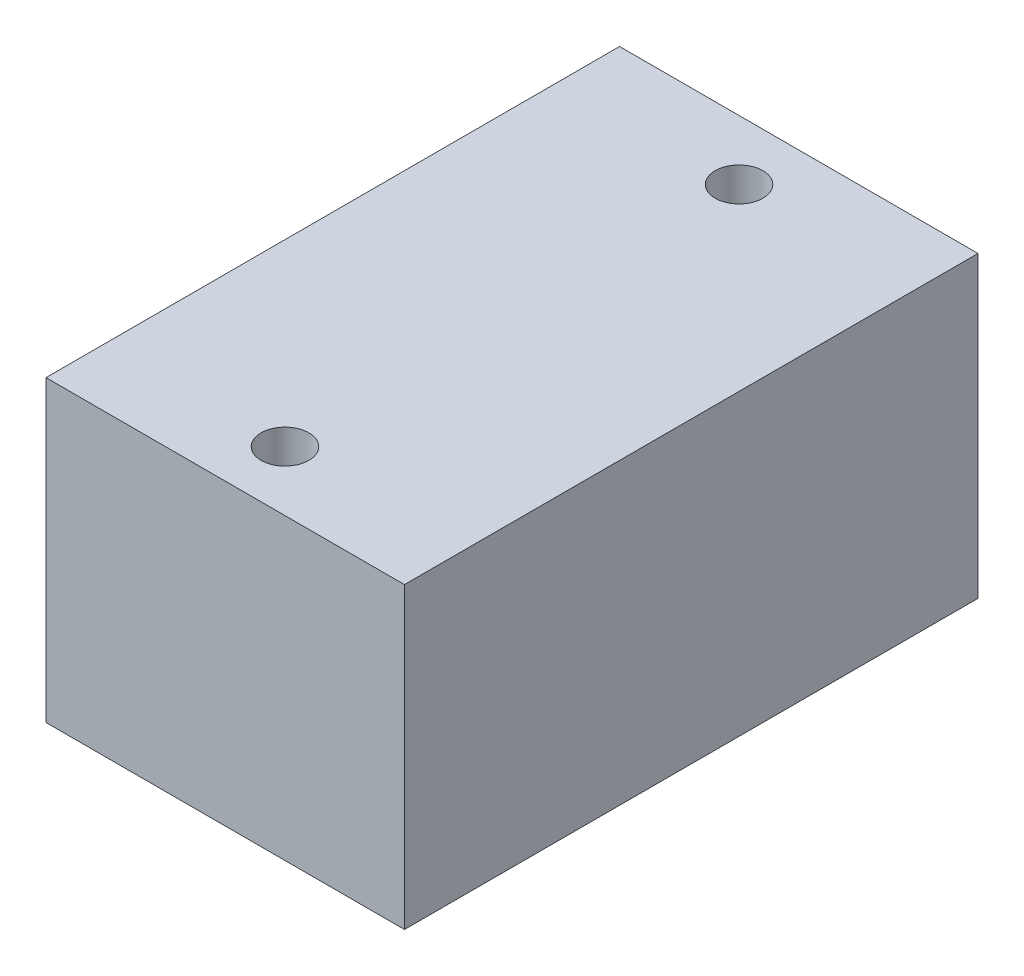
ISO-10303-21;
HEADER;
FILE_DESCRIPTION(('STEP AP214'),'2;1');
FILE_NAME('part.step','',(''),(''),'','','');
FILE_SCHEMA(('AUTOMOTIVE_DESIGN { 1 0 10303 214 1 1 1 1 }'));
ENDSEC;
DATA;
#1=APPLICATION_CONTEXT('core data for automotive mechanical design processes');
#2=APPLICATION_PROTOCOL_DEFINITION('international standard','automotive_design',2000,#1);
#3=PRODUCT_CONTEXT('',#1,'mechanical');
#4=PRODUCT('Part','Part','',(#3));
#5=PRODUCT_RELATED_PRODUCT_CATEGORY('part','',(#4));
#6=PRODUCT_DEFINITION_FORMATION('','',#4);
#7=PRODUCT_DEFINITION_CONTEXT('part definition',#1,'design');
#8=PRODUCT_DEFINITION('design','',#6,#7);
#9=PRODUCT_DEFINITION_SHAPE('','',#8);
#10=(LENGTH_UNIT() NAMED_UNIT(*) SI_UNIT(.MILLI.,.METRE.));
#11=(NAMED_UNIT(*) PLANE_ANGLE_UNIT() SI_UNIT($,.RADIAN.));
#12=(NAMED_UNIT(*) SI_UNIT($,.STERADIAN.) SOLID_ANGLE_UNIT());
#13=UNCERTAINTY_MEASURE_WITH_UNIT(LENGTH_MEASURE(1.E-05),#10,'distance_accuracy_value','');
#14=(GEOMETRIC_REPRESENTATION_CONTEXT(3) GLOBAL_UNCERTAINTY_ASSIGNED_CONTEXT((#13)) GLOBAL_UNIT_ASSIGNED_CONTEXT((#10,
#11,#12)) REPRESENTATION_CONTEXT('',''));
#15=CARTESIAN_POINT('',(0.,0.,0.));
#16=DIRECTION('',(0.,0.,1.));
#17=DIRECTION('',(1.,0.,0.));
#18=AXIS2_PLACEMENT_3D('',#15,#16,#17);
#19=CARTESIAN_POINT('',(0.,0.,48.));
#20=DIRECTION('',(1.,0.,0.));
#21=DIRECTION('',(0.,1.,0.));
#22=AXIS2_PLACEMENT_3D('',#19,#20,#21);
#23=PLANE('',#22);
#24=DIRECTION('',(0.,-1.,0.));
#25=VECTOR('',#24,1.);
#26=CARTESIAN_POINT('',(0.,0.,0.));
#27=LINE('',#26,#25);
#28=CARTESIAN_POINT('',(0.,25.,0.));
#29=VERTEX_POINT('',#28);
#30=CARTESIAN_POINT('',(0.,0.,0.));
#31=VERTEX_POINT('',#30);
#32=EDGE_CURVE('E110',#29,#31,#27,.T.);
#33=ORIENTED_EDGE('',*,*,#32,.T.);
#34=DIRECTION('',(0.,0.,-1.));
#35=VECTOR('',#34,1.);
#36=CARTESIAN_POINT('',(0.,0.,48.));
#37=LINE('',#36,#35);
#38=CARTESIAN_POINT('',(0.,0.,48.));
#39=VERTEX_POINT('',#38);
#40=EDGE_CURVE('E11',#39,#31,#37,.T.);
#41=ORIENTED_EDGE('',*,*,#40,.F.);
#42=DIRECTION('',(0.,-1.,0.));
#43=VECTOR('',#42,1.);
#44=CARTESIAN_POINT('',(0.,0.,48.));
#45=LINE('',#44,#43);
#46=CARTESIAN_POINT('',(0.,25.,48.));
#47=VERTEX_POINT('',#46);
#48=EDGE_CURVE('E93',#47,#39,#45,.T.);
#49=ORIENTED_EDGE('',*,*,#48,.F.);
#50=DIRECTION('',(0.,0.,-1.));
#51=VECTOR('',#50,1.);
#52=CARTESIAN_POINT('',(0.,25.,48.));
#53=LINE('',#52,#51);
#54=EDGE_CURVE('E106',#47,#29,#53,.T.);
#55=ORIENTED_EDGE('',*,*,#54,.T.);
#56=EDGE_LOOP('',(#33,#41,#49,#55));
#57=FACE_BOUND('',#56,.T.);
#58=ADVANCED_FACE('F41',(#57),#23,.F.);
#59=CARTESIAN_POINT('',(0.,0.,48.));
#60=DIRECTION('',(0.,1.,0.));
#61=DIRECTION('',(0.,0.,1.));
#62=AXIS2_PLACEMENT_3D('',#59,#60,#61);
#63=PLANE('',#62);
#64=CARTESIAN_POINT('',(15.,0.,39.));
#65=DIRECTION('',(0.,-1.,0.));
#66=DIRECTION('',(0.,0.,-1.));
#67=AXIS2_PLACEMENT_3D('',#64,#65,#66);
#68=CIRCLE('',#67,2.);
#69=CARTESIAN_POINT('',(15.,0.,37.));
#70=VERTEX_POINT('',#69);
#71=EDGE_CURVE('E157',#70,#70,#68,.T.);
#72=ORIENTED_EDGE('',*,*,#71,.F.);
#73=EDGE_LOOP('',(#72));
#74=FACE_BOUND('',#73,.T.);
#75=CARTESIAN_POINT('',(15.,0.,9.00000000000001));
#76=DIRECTION('',(0.,-1.,0.));
#77=DIRECTION('',(0.,0.,-1.));
#78=AXIS2_PLACEMENT_3D('',#75,#76,#77);
#79=CIRCLE('',#78,2.);
#80=CARTESIAN_POINT('',(15.,0.,7.00000000000001));
#81=VERTEX_POINT('',#80);
#82=EDGE_CURVE('E149',#81,#81,#79,.T.);
#83=ORIENTED_EDGE('',*,*,#82,.F.);
#84=EDGE_LOOP('',(#83));
#85=FACE_BOUND('',#84,.T.);
#86=DIRECTION('',(1.,0.,0.));
#87=VECTOR('',#86,1.);
#88=CARTESIAN_POINT('',(0.,0.,0.));
#89=LINE('',#88,#87);
#90=CARTESIAN_POINT('',(30.,0.,0.));
#91=VERTEX_POINT('',#90);
#92=EDGE_CURVE('E98',#31,#91,#89,.T.);
#93=ORIENTED_EDGE('',*,*,#92,.T.);
#94=DIRECTION('',(0.,0.,-1.));
#95=VECTOR('',#94,1.);
#96=CARTESIAN_POINT('',(30.,0.,47.9999999999999));
#97=LINE('',#96,#95);
#98=CARTESIAN_POINT('',(30.,0.,47.9999999999999));
#99=VERTEX_POINT('',#98);
#100=EDGE_CURVE('E50',#99,#91,#97,.T.);
#101=ORIENTED_EDGE('',*,*,#100,.F.);
#102=DIRECTION('',(1.,0.,0.));
#103=VECTOR('',#102,1.);
#104=CARTESIAN_POINT('',(0.,0.,48.));
#105=LINE('',#104,#103);
#106=EDGE_CURVE('E88',#39,#99,#105,.T.);
#107=ORIENTED_EDGE('',*,*,#106,.F.);
#108=ORIENTED_EDGE('',*,*,#40,.T.);
#109=EDGE_LOOP('',(#93,#101,#107,#108));
#110=FACE_BOUND('',#109,.T.);
#111=ADVANCED_FACE('F97',(#74,#85,#110),#63,.F.);
#112=CARTESIAN_POINT('',(30.,0.,47.9999999999999));
#113=DIRECTION('',(-1.,0.,0.));
#114=DIRECTION('',(0.,0.,1.));
#115=AXIS2_PLACEMENT_3D('',#112,#113,#114);
#116=PLANE('',#115);
#117=DIRECTION('',(0.,1.,0.));
#118=VECTOR('',#117,1.);
#119=CARTESIAN_POINT('',(30.,0.,0.));
#120=LINE('',#119,#118);
#121=CARTESIAN_POINT('',(30.,25.,0.));
#122=VERTEX_POINT('',#121);
#123=EDGE_CURVE('E75',#91,#122,#120,.T.);
#124=ORIENTED_EDGE('',*,*,#123,.T.);
#125=DIRECTION('',(0.,0.,-1.));
#126=VECTOR('',#125,1.);
#127=CARTESIAN_POINT('',(30.,25.,47.9999999999999));
#128=LINE('',#127,#126);
#129=CARTESIAN_POINT('',(30.,25.,47.9999999999999));
#130=VERTEX_POINT('',#129);
#131=EDGE_CURVE('E100',#130,#122,#128,.T.);
#132=ORIENTED_EDGE('',*,*,#131,.F.);
#133=DIRECTION('',(0.,1.,0.));
#134=VECTOR('',#133,1.);
#135=CARTESIAN_POINT('',(30.,0.,47.9999999999999));
#136=LINE('',#135,#134);
#137=EDGE_CURVE('E91',#99,#130,#136,.T.);
#138=ORIENTED_EDGE('',*,*,#137,.F.);
#139=ORIENTED_EDGE('',*,*,#100,.T.);
#140=EDGE_LOOP('',(#124,#132,#138,#139));
#141=FACE_BOUND('',#140,.T.);
#142=ADVANCED_FACE('F101',(#141),#116,.F.);
#143=CARTESIAN_POINT('',(0.,25.,48.));
#144=DIRECTION('',(0.,-1.,0.));
#145=DIRECTION('',(1.,0.,0.));
#146=AXIS2_PLACEMENT_3D('',#143,#144,#145);
#147=PLANE('',#146);
#148=CARTESIAN_POINT('',(15.,25.,5.));
#149=DIRECTION('',(0.,1.,0.));
#150=DIRECTION('',(-1.,0.,0.));
#151=AXIS2_PLACEMENT_3D('',#148,#149,#150);
#152=CIRCLE('',#151,2.);
#153=CARTESIAN_POINT('',(13.,25.,5.));
#154=VERTEX_POINT('',#153);
#155=EDGE_CURVE('E142',#154,#154,#152,.T.);
#156=ORIENTED_EDGE('',*,*,#155,.F.);
#157=EDGE_LOOP('',(#156));
#158=FACE_BOUND('',#157,.T.);
#159=CARTESIAN_POINT('',(14.9999999999999,25.,42.9999999999999));
#160=DIRECTION('',(0.,1.,0.));
#161=DIRECTION('',(-1.,0.,0.));
#162=AXIS2_PLACEMENT_3D('',#159,#160,#161);
#163=CIRCLE('',#162,2.);
#164=CARTESIAN_POINT('',(12.9999999999999,25.,42.9999999999999));
#165=VERTEX_POINT('',#164);
#166=EDGE_CURVE('E133',#165,#165,#163,.T.);
#167=ORIENTED_EDGE('',*,*,#166,.F.);
#168=EDGE_LOOP('',(#167));
#169=FACE_BOUND('',#168,.T.);
#170=DIRECTION('',(-1.,0.,0.));
#171=VECTOR('',#170,1.);
#172=CARTESIAN_POINT('',(0.,25.,0.));
#173=LINE('',#172,#171);
#174=EDGE_CURVE('E81',#122,#29,#173,.T.);
#175=ORIENTED_EDGE('',*,*,#174,.T.);
#176=ORIENTED_EDGE('',*,*,#54,.F.);
#177=DIRECTION('',(-1.,0.,0.));
#178=VECTOR('',#177,1.);
#179=CARTESIAN_POINT('',(0.,25.,48.));
#180=LINE('',#179,#178);
#181=EDGE_CURVE('E58',#130,#47,#180,.T.);
#182=ORIENTED_EDGE('',*,*,#181,.F.);
#183=ORIENTED_EDGE('',*,*,#131,.T.);
#184=EDGE_LOOP('',(#175,#176,#182,#183));
#185=FACE_BOUND('',#184,.T.);
#186=ADVANCED_FACE('F125',(#158,#169,#185),#147,.F.);
#187=CARTESIAN_POINT('',(0.,0.,48.));
#188=DIRECTION('',(0.,0.,-1.));
#189=DIRECTION('',(-1.,0.,0.));
#190=AXIS2_PLACEMENT_3D('',#187,#188,#189);
#191=PLANE('',#190);
#192=ORIENTED_EDGE('',*,*,#48,.T.);
#193=ORIENTED_EDGE('',*,*,#106,.T.);
#194=ORIENTED_EDGE('',*,*,#137,.T.);
#195=ORIENTED_EDGE('',*,*,#181,.T.);
#196=EDGE_LOOP('',(#192,#193,#194,#195));
#197=FACE_BOUND('',#196,.T.);
#198=ADVANCED_FACE('F89',(#197),#191,.F.);
#199=CARTESIAN_POINT('',(0.,0.,0.));
#200=DIRECTION('',(0.,0.,-1.));
#201=DIRECTION('',(-1.,0.,0.));
#202=AXIS2_PLACEMENT_3D('',#199,#200,#201);
#203=PLANE('',#202);
#204=ORIENTED_EDGE('',*,*,#32,.F.);
#205=ORIENTED_EDGE('',*,*,#174,.F.);
#206=ORIENTED_EDGE('',*,*,#123,.F.);
#207=ORIENTED_EDGE('',*,*,#92,.F.);
#208=EDGE_LOOP('',(#204,#205,#206,#207));
#209=FACE_BOUND('',#208,.T.);
#210=ADVANCED_FACE('F128',(#209),#203,.T.);
#211=CARTESIAN_POINT('',(14.9999999999999,15.,42.9999999999999));
#212=DIRECTION('',(0.,1.,0.));
#213=DIRECTION('',(-1.,0.,0.));
#214=AXIS2_PLACEMENT_3D('',#211,#212,#213);
#215=CYLINDRICAL_SURFACE('',#214,2.);
#216=CARTESIAN_POINT('',(14.9999999999999,15.,42.9999999999999));
#217=DIRECTION('',(0.,1.,0.));
#218=DIRECTION('',(-1.,0.,0.));
#219=AXIS2_PLACEMENT_3D('',#216,#217,#218);
#220=CIRCLE('',#219,2.);
#221=CARTESIAN_POINT('',(12.9999999999999,15.,42.9999999999999));
#222=VERTEX_POINT('',#221);
#223=EDGE_CURVE('E137',#222,#222,#220,.T.);
#224=ORIENTED_EDGE('',*,*,#223,.F.);
#225=EDGE_LOOP('',(#224));
#226=FACE_BOUND('',#225,.T.);
#227=ORIENTED_EDGE('',*,*,#166,.T.);
#228=EDGE_LOOP('',(#227));
#229=FACE_BOUND('',#228,.T.);
#230=ADVANCED_FACE('F226',(#226,#229),#215,.F.);
#231=CARTESIAN_POINT('',(14.9999999999999,15.,42.9999999999999));
#232=DIRECTION('',(0.,1.,0.));
#233=DIRECTION('',(-1.,0.,0.));
#234=AXIS2_PLACEMENT_3D('',#231,#232,#233);
#235=PLANE('',#234);
#236=ORIENTED_EDGE('',*,*,#223,.T.);
#237=EDGE_LOOP('',(#236));
#238=FACE_BOUND('',#237,.T.);
#239=ADVANCED_FACE('F233',(#238),#235,.T.);
#240=CARTESIAN_POINT('',(15.,15.,5.));
#241=DIRECTION('',(0.,1.,0.));
#242=DIRECTION('',(-1.,0.,0.));
#243=AXIS2_PLACEMENT_3D('',#240,#241,#242);
#244=CYLINDRICAL_SURFACE('',#243,2.);
#245=CARTESIAN_POINT('',(15.,15.,5.));
#246=DIRECTION('',(0.,1.,0.));
#247=DIRECTION('',(-1.,0.,0.));
#248=AXIS2_PLACEMENT_3D('',#245,#246,#247);
#249=CIRCLE('',#248,2.);
#250=CARTESIAN_POINT('',(13.,15.,5.));
#251=VERTEX_POINT('',#250);
#252=EDGE_CURVE('E114',#251,#251,#249,.T.);
#253=ORIENTED_EDGE('',*,*,#252,.F.);
#254=EDGE_LOOP('',(#253));
#255=FACE_BOUND('',#254,.T.);
#256=ORIENTED_EDGE('',*,*,#155,.T.);
#257=EDGE_LOOP('',(#256));
#258=FACE_BOUND('',#257,.T.);
#259=ADVANCED_FACE('F190',(#255,#258),#244,.F.);
#260=CARTESIAN_POINT('',(15.,15.,5.));
#261=DIRECTION('',(0.,1.,0.));
#262=DIRECTION('',(-1.,0.,0.));
#263=AXIS2_PLACEMENT_3D('',#260,#261,#262);
#264=PLANE('',#263);
#265=ORIENTED_EDGE('',*,*,#252,.T.);
#266=EDGE_LOOP('',(#265));
#267=FACE_BOUND('',#266,.T.);
#268=ADVANCED_FACE('F181',(#267),#264,.T.);
#269=CARTESIAN_POINT('',(15.,10.,9.00000000000001));
#270=DIRECTION('',(0.,-1.,0.));
#271=DIRECTION('',(0.,0.,-1.));
#272=AXIS2_PLACEMENT_3D('',#269,#270,#271);
#273=CYLINDRICAL_SURFACE('',#272,2.);
#274=CARTESIAN_POINT('',(15.,10.,9.00000000000001));
#275=DIRECTION('',(0.,-1.,0.));
#276=DIRECTION('',(0.,0.,-1.));
#277=AXIS2_PLACEMENT_3D('',#274,#275,#276);
#278=CIRCLE('',#277,2.);
#279=CARTESIAN_POINT('',(15.,10.,7.00000000000001));
#280=VERTEX_POINT('',#279);
#281=EDGE_CURVE('E153',#280,#280,#278,.T.);
#282=ORIENTED_EDGE('',*,*,#281,.F.);
#283=EDGE_LOOP('',(#282));
#284=FACE_BOUND('',#283,.T.);
#285=ORIENTED_EDGE('',*,*,#82,.T.);
#286=EDGE_LOOP('',(#285));
#287=FACE_BOUND('',#286,.T.);
#288=ADVANCED_FACE('F179',(#284,#287),#273,.F.);
#289=CARTESIAN_POINT('',(15.,10.,9.00000000000001));
#290=DIRECTION('',(0.,-1.,0.));
#291=DIRECTION('',(0.,0.,-1.));
#292=AXIS2_PLACEMENT_3D('',#289,#290,#291);
#293=PLANE('',#292);
#294=ORIENTED_EDGE('',*,*,#281,.T.);
#295=EDGE_LOOP('',(#294));
#296=FACE_BOUND('',#295,.T.);
#297=ADVANCED_FACE('F171',(#296),#293,.T.);
#298=CARTESIAN_POINT('',(15.,10.,39.));
#299=DIRECTION('',(0.,-1.,0.));
#300=DIRECTION('',(0.,0.,-1.));
#301=AXIS2_PLACEMENT_3D('',#298,#299,#300);
#302=CYLINDRICAL_SURFACE('',#301,2.);
#303=CARTESIAN_POINT('',(15.,10.,39.));
#304=DIRECTION('',(0.,-1.,0.));
#305=DIRECTION('',(0.,0.,-1.));
#306=AXIS2_PLACEMENT_3D('',#303,#304,#305);
#307=CIRCLE('',#306,2.);
#308=CARTESIAN_POINT('',(15.,10.,37.));
#309=VERTEX_POINT('',#308);
#310=EDGE_CURVE('E138',#309,#309,#307,.T.);
#311=ORIENTED_EDGE('',*,*,#310,.F.);
#312=EDGE_LOOP('',(#311));
#313=FACE_BOUND('',#312,.T.);
#314=ORIENTED_EDGE('',*,*,#71,.T.);
#315=EDGE_LOOP('',(#314));
#316=FACE_BOUND('',#315,.T.);
#317=ADVANCED_FACE('F168',(#313,#316),#302,.F.);
#318=CARTESIAN_POINT('',(15.,10.,39.));
#319=DIRECTION('',(0.,-1.,0.));
#320=DIRECTION('',(0.,0.,-1.));
#321=AXIS2_PLACEMENT_3D('',#318,#319,#320);
#322=PLANE('',#321);
#323=ORIENTED_EDGE('',*,*,#310,.T.);
#324=EDGE_LOOP('',(#323));
#325=FACE_BOUND('',#324,.T.);
#326=ADVANCED_FACE('F166',(#325),#322,.T.);
#327=CLOSED_SHELL('',(#58,#111,#142,#186,#198,#210,#230,#239,#259,#268,#288,#297,#317,#326));
#328=MANIFOLD_SOLID_BREP('B2',#327);
#329=ADVANCED_BREP_SHAPE_REPRESENTATION('',(#18,#328),#14);
#330=SHAPE_DEFINITION_REPRESENTATION(#9,#329);
ENDSEC;
END-ISO-10303-21;
